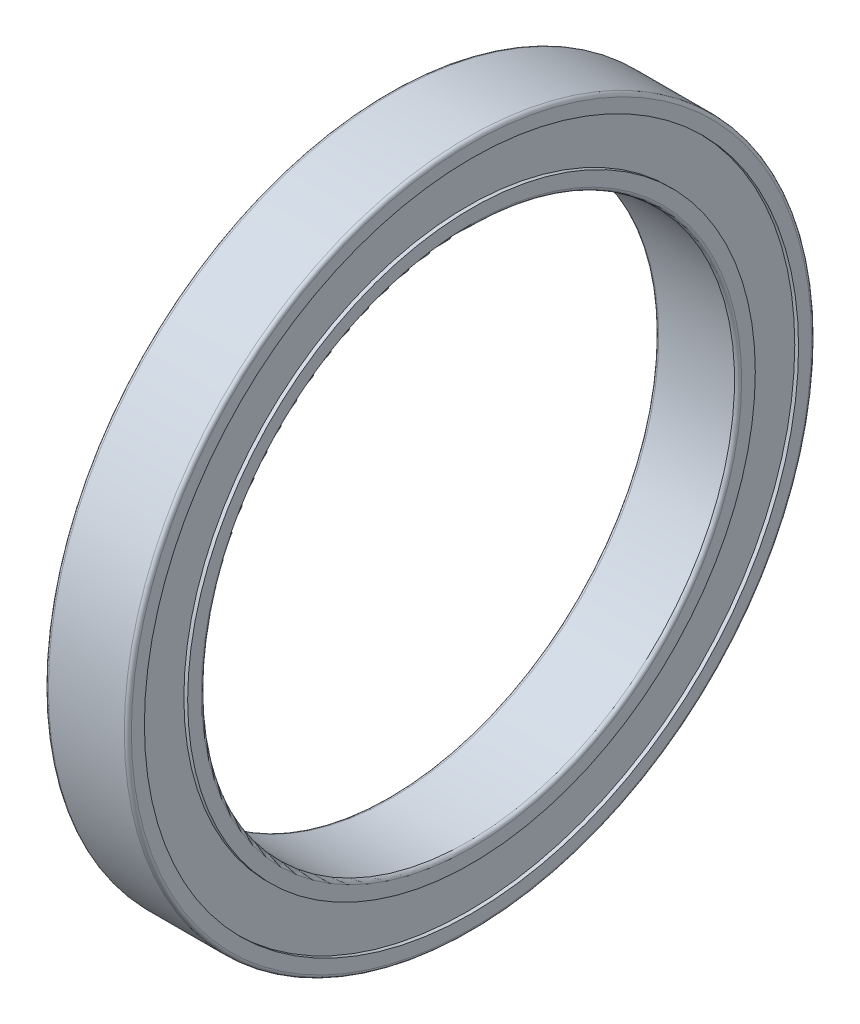
ISO-10303-21;
HEADER;
FILE_DESCRIPTION(('STEP AP214'),'2;1');
FILE_NAME('part.step','',(''),(''),'','','');
FILE_SCHEMA(('AUTOMOTIVE_DESIGN { 1 0 10303 214 1 1 1 1 }'));
ENDSEC;
DATA;
#1=APPLICATION_CONTEXT('core data for automotive mechanical design processes');
#2=APPLICATION_PROTOCOL_DEFINITION('international standard','automotive_design',2000,#1);
#3=PRODUCT_CONTEXT('',#1,'mechanical');
#4=PRODUCT('Part','Part','',(#3));
#5=PRODUCT_RELATED_PRODUCT_CATEGORY('part','',(#4));
#6=PRODUCT_DEFINITION_FORMATION('','',#4);
#7=PRODUCT_DEFINITION_CONTEXT('part definition',#1,'design');
#8=PRODUCT_DEFINITION('design','',#6,#7);
#9=PRODUCT_DEFINITION_SHAPE('','',#8);
#10=(LENGTH_UNIT() NAMED_UNIT(*) SI_UNIT(.MILLI.,.METRE.));
#11=(NAMED_UNIT(*) PLANE_ANGLE_UNIT() SI_UNIT($,.RADIAN.));
#12=(NAMED_UNIT(*) SI_UNIT($,.STERADIAN.) SOLID_ANGLE_UNIT());
#13=UNCERTAINTY_MEASURE_WITH_UNIT(LENGTH_MEASURE(1.E-05),#10,'distance_accuracy_value','');
#14=(GEOMETRIC_REPRESENTATION_CONTEXT(3) GLOBAL_UNCERTAINTY_ASSIGNED_CONTEXT((#13)) GLOBAL_UNIT_ASSIGNED_CONTEXT((#10,
#11,#12)) REPRESENTATION_CONTEXT('',''));
#15=CARTESIAN_POINT('',(0.,0.,0.));
#16=DIRECTION('',(0.,0.,1.));
#17=DIRECTION('',(1.,0.,0.));
#18=AXIS2_PLACEMENT_3D('',#15,#16,#17);
#19=CARTESIAN_POINT('',(0.,29.,0.));
#20=DIRECTION('',(1.,0.,0.));
#21=DIRECTION('',(0.,0.,-1.));
#22=AXIS2_PLACEMENT_3D('',#19,#20,#21);
#23=PLANE('',#22);
#24=CARTESIAN_POINT('',(0.,0.,0.));
#25=DIRECTION('',(1.,0.,0.));
#26=DIRECTION('',(0.,0.,-1.));
#27=AXIS2_PLACEMENT_3D('',#24,#25,#26);
#28=CIRCLE('',#27,28.7);
#29=CARTESIAN_POINT('',(0.,0.,-28.7));
#30=VERTEX_POINT('',#29);
#31=EDGE_CURVE('E54',#30,#30,#28,.F.);
#32=ORIENTED_EDGE('',*,*,#31,.T.);
#33=EDGE_LOOP('',(#32));
#34=FACE_BOUND('',#33,.T.);
#35=CARTESIAN_POINT('',(0.,0.,0.));
#36=DIRECTION('',(-1.,0.,0.));
#37=DIRECTION('',(0.,0.,1.));
#38=AXIS2_PLACEMENT_3D('',#35,#36,#37);
#39=CIRCLE('',#38,27.6);
#40=CARTESIAN_POINT('',(0.,0.,27.6));
#41=VERTEX_POINT('',#40);
#42=EDGE_CURVE('E66',#41,#41,#39,.T.);
#43=ORIENTED_EDGE('',*,*,#42,.F.);
#44=EDGE_LOOP('',(#43));
#45=FACE_BOUND('',#44,.T.);
#46=ADVANCED_FACE('F34',(#34,#45),#23,.F.);
#47=CARTESIAN_POINT('',(0.,0.,0.));
#48=DIRECTION('',(-1.,0.,0.));
#49=DIRECTION('',(0.,0.,1.));
#50=AXIS2_PLACEMENT_3D('',#47,#48,#49);
#51=CYLINDRICAL_SURFACE('',#50,27.6);
#52=CARTESIAN_POINT('',(0.319999999999998,0.,0.));
#53=DIRECTION('',(-1.,0.,0.));
#54=DIRECTION('',(0.,0.,1.));
#55=AXIS2_PLACEMENT_3D('',#52,#53,#54);
#56=CIRCLE('',#55,27.6);
#57=CARTESIAN_POINT('',(0.319999999999998,0.,27.6));
#58=VERTEX_POINT('',#57);
#59=EDGE_CURVE('E69',#58,#58,#56,.T.);
#60=ORIENTED_EDGE('',*,*,#59,.F.);
#61=EDGE_LOOP('',(#60));
#62=FACE_BOUND('',#61,.T.);
#63=ORIENTED_EDGE('',*,*,#42,.T.);
#64=EDGE_LOOP('',(#63));
#65=FACE_BOUND('',#64,.T.);
#66=ADVANCED_FACE('F122',(#62,#65),#51,.F.);
#67=CARTESIAN_POINT('',(0.319999999999998,27.6,0.));
#68=DIRECTION('',(1.,0.,0.));
#69=DIRECTION('',(0.,0.,-1.));
#70=AXIS2_PLACEMENT_3D('',#67,#68,#69);
#71=PLANE('',#70);
#72=CARTESIAN_POINT('',(0.319999999999998,0.,0.));
#73=DIRECTION('',(-1.,0.,0.));
#74=DIRECTION('',(0.,0.,1.));
#75=AXIS2_PLACEMENT_3D('',#72,#73,#74);
#76=CIRCLE('',#75,23.95);
#77=CARTESIAN_POINT('',(0.319999999999998,0.,23.95));
#78=VERTEX_POINT('',#77);
#79=EDGE_CURVE('E72',#78,#78,#76,.T.);
#80=ORIENTED_EDGE('',*,*,#79,.F.);
#81=EDGE_LOOP('',(#80));
#82=FACE_BOUND('',#81,.T.);
#83=ORIENTED_EDGE('',*,*,#59,.T.);
#84=EDGE_LOOP('',(#83));
#85=FACE_BOUND('',#84,.T.);
#86=ADVANCED_FACE('F128',(#82,#85),#71,.F.);
#87=CARTESIAN_POINT('',(0.,0.,0.));
#88=DIRECTION('',(-1.,0.,0.));
#89=DIRECTION('',(0.,0.,1.));
#90=AXIS2_PLACEMENT_3D('',#87,#88,#89);
#91=CYLINDRICAL_SURFACE('',#90,23.95);
#92=CARTESIAN_POINT('',(0.,0.,0.));
#93=DIRECTION('',(-1.,0.,0.));
#94=DIRECTION('',(0.,0.,1.));
#95=AXIS2_PLACEMENT_3D('',#92,#93,#94);
#96=CIRCLE('',#95,23.95);
#97=CARTESIAN_POINT('',(0.,0.,23.95));
#98=VERTEX_POINT('',#97);
#99=EDGE_CURVE('E75',#98,#98,#96,.T.);
#100=ORIENTED_EDGE('',*,*,#99,.F.);
#101=EDGE_LOOP('',(#100));
#102=FACE_BOUND('',#101,.T.);
#103=ORIENTED_EDGE('',*,*,#79,.T.);
#104=EDGE_LOOP('',(#103));
#105=FACE_BOUND('',#104,.T.);
#106=ADVANCED_FACE('F181',(#102,#105),#91,.T.);
#107=CARTESIAN_POINT('',(0.,23.95,0.));
#108=DIRECTION('',(1.,0.,0.));
#109=DIRECTION('',(0.,0.,-1.));
#110=AXIS2_PLACEMENT_3D('',#107,#108,#109);
#111=PLANE('',#110);
#112=CARTESIAN_POINT('',(0.,0.,0.));
#113=DIRECTION('',(1.,0.,0.));
#114=DIRECTION('',(0.,0.,-1.));
#115=AXIS2_PLACEMENT_3D('',#112,#113,#114);
#116=CIRCLE('',#115,22.8);
#117=CARTESIAN_POINT('',(0.,0.,-22.8));
#118=VERTEX_POINT('',#117);
#119=EDGE_CURVE('E10',#118,#118,#116,.T.);
#120=ORIENTED_EDGE('',*,*,#119,.T.);
#121=EDGE_LOOP('',(#120));
#122=FACE_BOUND('',#121,.T.);
#123=ORIENTED_EDGE('',*,*,#99,.T.);
#124=EDGE_LOOP('',(#123));
#125=FACE_BOUND('',#124,.T.);
#126=ADVANCED_FACE('F119',(#122,#125),#111,.F.);
#127=CARTESIAN_POINT('',(0.,0.,0.));
#128=DIRECTION('',(-1.,0.,0.));
#129=DIRECTION('',(0.,0.,1.));
#130=AXIS2_PLACEMENT_3D('',#127,#128,#129);
#131=CYLINDRICAL_SURFACE('',#130,22.5);
#132=CARTESIAN_POINT('',(6.7,0.,0.));
#133=DIRECTION('',(-1.,0.,0.));
#134=DIRECTION('',(0.,0.,1.));
#135=AXIS2_PLACEMENT_3D('',#132,#133,#134);
#136=CIRCLE('',#135,22.5);
#137=CARTESIAN_POINT('',(6.7,0.,22.5));
#138=VERTEX_POINT('',#137);
#139=EDGE_CURVE('E41',#138,#138,#136,.F.);
#140=ORIENTED_EDGE('',*,*,#139,.T.);
#141=EDGE_LOOP('',(#140));
#142=FACE_BOUND('',#141,.T.);
#143=CARTESIAN_POINT('',(0.299999999999998,0.,0.));
#144=DIRECTION('',(1.,0.,0.));
#145=DIRECTION('',(0.,0.,-1.));
#146=AXIS2_PLACEMENT_3D('',#143,#144,#145);
#147=CIRCLE('',#146,22.5);
#148=CARTESIAN_POINT('',(0.299999999999998,0.,-22.5));
#149=VERTEX_POINT('',#148);
#150=EDGE_CURVE('E45',#149,#149,#147,.F.);
#151=ORIENTED_EDGE('',*,*,#150,.T.);
#152=EDGE_LOOP('',(#151));
#153=FACE_BOUND('',#152,.T.);
#154=ADVANCED_FACE('F113',(#142,#153),#131,.F.);
#155=CARTESIAN_POINT('',(7.,23.95,0.));
#156=DIRECTION('',(-1.,0.,0.));
#157=DIRECTION('',(0.,0.,1.));
#158=AXIS2_PLACEMENT_3D('',#155,#156,#157);
#159=PLANE('',#158);
#160=CARTESIAN_POINT('',(7.,0.,0.));
#161=DIRECTION('',(-1.,0.,0.));
#162=DIRECTION('',(0.,0.,1.));
#163=AXIS2_PLACEMENT_3D('',#160,#161,#162);
#164=CIRCLE('',#163,22.8);
#165=CARTESIAN_POINT('',(7.,0.,22.8));
#166=VERTEX_POINT('',#165);
#167=EDGE_CURVE('E49',#166,#166,#164,.T.);
#168=ORIENTED_EDGE('',*,*,#167,.T.);
#169=EDGE_LOOP('',(#168));
#170=FACE_BOUND('',#169,.T.);
#171=CARTESIAN_POINT('',(7.,0.,0.));
#172=DIRECTION('',(-1.,0.,0.));
#173=DIRECTION('',(0.,0.,1.));
#174=AXIS2_PLACEMENT_3D('',#171,#172,#173);
#175=CIRCLE('',#174,23.95);
#176=CARTESIAN_POINT('',(7.,0.,23.95));
#177=VERTEX_POINT('',#176);
#178=EDGE_CURVE('E78',#177,#177,#175,.T.);
#179=ORIENTED_EDGE('',*,*,#178,.F.);
#180=EDGE_LOOP('',(#179));
#181=FACE_BOUND('',#180,.T.);
#182=ADVANCED_FACE('F108',(#170,#181),#159,.F.);
#183=CARTESIAN_POINT('',(0.,0.,0.));
#184=DIRECTION('',(-1.,0.,0.));
#185=DIRECTION('',(0.,0.,1.));
#186=AXIS2_PLACEMENT_3D('',#183,#184,#185);
#187=CYLINDRICAL_SURFACE('',#186,23.95);
#188=CARTESIAN_POINT('',(6.68,0.,0.));
#189=DIRECTION('',(-1.,0.,0.));
#190=DIRECTION('',(0.,0.,1.));
#191=AXIS2_PLACEMENT_3D('',#188,#189,#190);
#192=CIRCLE('',#191,23.95);
#193=CARTESIAN_POINT('',(6.68,0.,23.95));
#194=VERTEX_POINT('',#193);
#195=EDGE_CURVE('E81',#194,#194,#192,.T.);
#196=ORIENTED_EDGE('',*,*,#195,.F.);
#197=EDGE_LOOP('',(#196));
#198=FACE_BOUND('',#197,.T.);
#199=ORIENTED_EDGE('',*,*,#178,.T.);
#200=EDGE_LOOP('',(#199));
#201=FACE_BOUND('',#200,.T.);
#202=ADVANCED_FACE('F102',(#198,#201),#187,.T.);
#203=CARTESIAN_POINT('',(6.68,27.6,0.));
#204=DIRECTION('',(-1.,0.,0.));
#205=DIRECTION('',(0.,0.,1.));
#206=AXIS2_PLACEMENT_3D('',#203,#204,#205);
#207=PLANE('',#206);
#208=CARTESIAN_POINT('',(6.68,0.,0.));
#209=DIRECTION('',(-1.,0.,0.));
#210=DIRECTION('',(0.,0.,1.));
#211=AXIS2_PLACEMENT_3D('',#208,#209,#210);
#212=CIRCLE('',#211,27.6);
#213=CARTESIAN_POINT('',(6.68,0.,27.6));
#214=VERTEX_POINT('',#213);
#215=EDGE_CURVE('E84',#214,#214,#212,.T.);
#216=ORIENTED_EDGE('',*,*,#215,.F.);
#217=EDGE_LOOP('',(#216));
#218=FACE_BOUND('',#217,.T.);
#219=ORIENTED_EDGE('',*,*,#195,.T.);
#220=EDGE_LOOP('',(#219));
#221=FACE_BOUND('',#220,.T.);
#222=ADVANCED_FACE('F96',(#218,#221),#207,.F.);
#223=CARTESIAN_POINT('',(0.,0.,0.));
#224=DIRECTION('',(-1.,0.,0.));
#225=DIRECTION('',(0.,0.,1.));
#226=AXIS2_PLACEMENT_3D('',#223,#224,#225);
#227=CYLINDRICAL_SURFACE('',#226,27.6);
#228=CARTESIAN_POINT('',(7.,0.,0.));
#229=DIRECTION('',(-1.,0.,0.));
#230=DIRECTION('',(0.,0.,1.));
#231=AXIS2_PLACEMENT_3D('',#228,#229,#230);
#232=CIRCLE('',#231,27.6);
#233=CARTESIAN_POINT('',(7.,0.,27.6));
#234=VERTEX_POINT('',#233);
#235=EDGE_CURVE('E87',#234,#234,#232,.T.);
#236=ORIENTED_EDGE('',*,*,#235,.F.);
#237=EDGE_LOOP('',(#236));
#238=FACE_BOUND('',#237,.T.);
#239=ORIENTED_EDGE('',*,*,#215,.T.);
#240=EDGE_LOOP('',(#239));
#241=FACE_BOUND('',#240,.T.);
#242=ADVANCED_FACE('F93',(#238,#241),#227,.F.);
#243=CARTESIAN_POINT('',(7.,29.,0.));
#244=DIRECTION('',(-1.,0.,0.));
#245=DIRECTION('',(0.,0.,1.));
#246=AXIS2_PLACEMENT_3D('',#243,#244,#245);
#247=PLANE('',#246);
#248=CARTESIAN_POINT('',(7.,0.,0.));
#249=DIRECTION('',(-1.,0.,0.));
#250=DIRECTION('',(0.,0.,1.));
#251=AXIS2_PLACEMENT_3D('',#248,#249,#250);
#252=CIRCLE('',#251,28.7);
#253=CARTESIAN_POINT('',(7.,0.,28.7));
#254=VERTEX_POINT('',#253);
#255=EDGE_CURVE('E57',#254,#254,#252,.F.);
#256=ORIENTED_EDGE('',*,*,#255,.T.);
#257=EDGE_LOOP('',(#256));
#258=FACE_BOUND('',#257,.T.);
#259=ORIENTED_EDGE('',*,*,#235,.T.);
#260=EDGE_LOOP('',(#259));
#261=FACE_BOUND('',#260,.T.);
#262=ADVANCED_FACE('F91',(#258,#261),#247,.F.);
#263=CARTESIAN_POINT('',(0.,0.,0.));
#264=DIRECTION('',(-1.,0.,0.));
#265=DIRECTION('',(0.,0.,1.));
#266=AXIS2_PLACEMENT_3D('',#263,#264,#265);
#267=CYLINDRICAL_SURFACE('',#266,29.);
#268=CARTESIAN_POINT('',(6.7,0.,0.));
#269=DIRECTION('',(-1.,0.,0.));
#270=DIRECTION('',(0.,0.,1.));
#271=AXIS2_PLACEMENT_3D('',#268,#269,#270);
#272=CIRCLE('',#271,29.);
#273=CARTESIAN_POINT('',(6.7,0.,29.));
#274=VERTEX_POINT('',#273);
#275=EDGE_CURVE('E60',#274,#274,#272,.T.);
#276=ORIENTED_EDGE('',*,*,#275,.T.);
#277=EDGE_LOOP('',(#276));
#278=FACE_BOUND('',#277,.T.);
#279=CARTESIAN_POINT('',(0.299999999999997,0.,0.));
#280=DIRECTION('',(1.,0.,0.));
#281=DIRECTION('',(0.,0.,-1.));
#282=AXIS2_PLACEMENT_3D('',#279,#280,#281);
#283=CIRCLE('',#282,29.);
#284=CARTESIAN_POINT('',(0.299999999999997,0.,-29.));
#285=VERTEX_POINT('',#284);
#286=EDGE_CURVE('E63',#285,#285,#283,.T.);
#287=ORIENTED_EDGE('',*,*,#286,.T.);
#288=EDGE_LOOP('',(#287));
#289=FACE_BOUND('',#288,.T.);
#290=ADVANCED_FACE('F138',(#278,#289),#267,.T.);
#291=CARTESIAN_POINT('',(6.7,0.,0.));
#292=DIRECTION('',(-1.,0.,0.));
#293=DIRECTION('',(0.,0.,1.));
#294=AXIS2_PLACEMENT_3D('',#291,#292,#293);
#295=TOROIDAL_SURFACE('',#294,28.7,0.3);
#296=ORIENTED_EDGE('',*,*,#255,.F.);
#297=EDGE_LOOP('',(#296));
#298=FACE_BOUND('',#297,.T.);
#299=ORIENTED_EDGE('',*,*,#275,.F.);
#300=EDGE_LOOP('',(#299));
#301=FACE_BOUND('',#300,.T.);
#302=ADVANCED_FACE('F134',(#298,#301),#295,.T.);
#303=CARTESIAN_POINT('',(0.299999999999997,0.,0.));
#304=DIRECTION('',(1.,0.,0.));
#305=DIRECTION('',(0.,0.,-1.));
#306=AXIS2_PLACEMENT_3D('',#303,#304,#305);
#307=TOROIDAL_SURFACE('',#306,28.7,0.3);
#308=ORIENTED_EDGE('',*,*,#286,.F.);
#309=EDGE_LOOP('',(#308));
#310=FACE_BOUND('',#309,.T.);
#311=ORIENTED_EDGE('',*,*,#31,.F.);
#312=EDGE_LOOP('',(#311));
#313=FACE_BOUND('',#312,.T.);
#314=ADVANCED_FACE('F137',(#310,#313),#307,.T.);
#315=CARTESIAN_POINT('',(6.7,0.,0.));
#316=DIRECTION('',(-1.,0.,0.));
#317=DIRECTION('',(0.,0.,1.));
#318=AXIS2_PLACEMENT_3D('',#315,#316,#317);
#319=TOROIDAL_SURFACE('',#318,22.8,0.3);
#320=ORIENTED_EDGE('',*,*,#139,.F.);
#321=EDGE_LOOP('',(#320));
#322=FACE_BOUND('',#321,.T.);
#323=ORIENTED_EDGE('',*,*,#167,.F.);
#324=EDGE_LOOP('',(#323));
#325=FACE_BOUND('',#324,.T.);
#326=ADVANCED_FACE('F141',(#322,#325),#319,.T.);
#327=CARTESIAN_POINT('',(0.299999999999998,0.,0.));
#328=DIRECTION('',(1.,0.,0.));
#329=DIRECTION('',(0.,0.,-1.));
#330=AXIS2_PLACEMENT_3D('',#327,#328,#329);
#331=TOROIDAL_SURFACE('',#330,22.8,0.3);
#332=ORIENTED_EDGE('',*,*,#119,.F.);
#333=EDGE_LOOP('',(#332));
#334=FACE_BOUND('',#333,.T.);
#335=ORIENTED_EDGE('',*,*,#150,.F.);
#336=EDGE_LOOP('',(#335));
#337=FACE_BOUND('',#336,.T.);
#338=ADVANCED_FACE('F36',(#334,#337),#331,.T.);
#339=CLOSED_SHELL('',(#46,#66,#86,#106,#126,#154,#182,#202,#222,#242,#262,#290,#302,#314,#326,#338));
#340=MANIFOLD_SOLID_BREP('B2',#339);
#341=ADVANCED_BREP_SHAPE_REPRESENTATION('',(#18,#340),#14);
#342=SHAPE_DEFINITION_REPRESENTATION(#9,#341);
ENDSEC;
END-ISO-10303-21;
